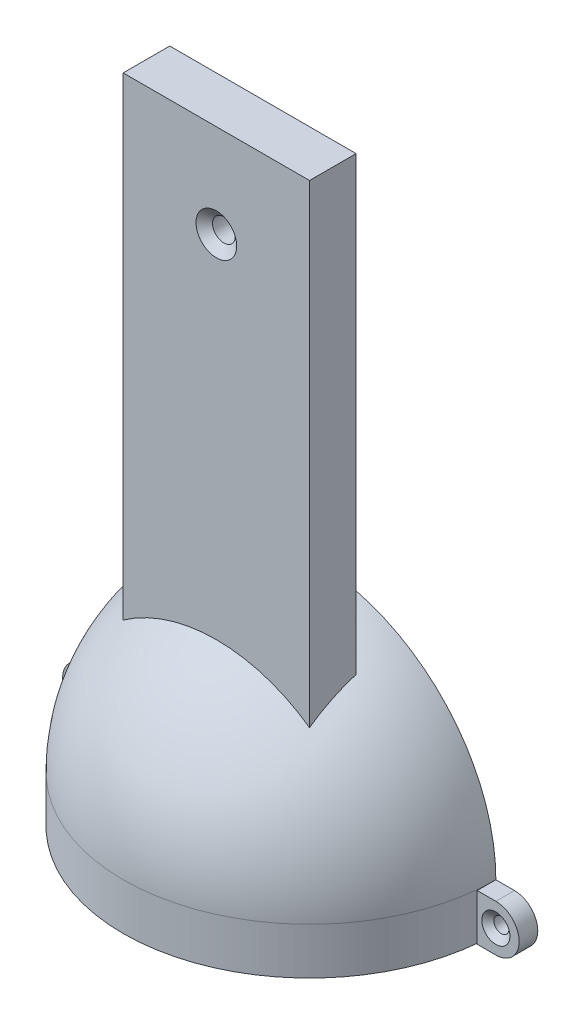
ISO-10303-21;
HEADER;
FILE_DESCRIPTION(('STEP AP214'),'2;1');
FILE_NAME('part.step','',(''),(''),'','','');
FILE_SCHEMA(('AUTOMOTIVE_DESIGN { 1 0 10303 214 1 1 1 1 }'));
ENDSEC;
DATA;
#1=APPLICATION_CONTEXT('core data for automotive mechanical design processes');
#2=APPLICATION_PROTOCOL_DEFINITION('international standard','automotive_design',2000,#1);
#3=PRODUCT_CONTEXT('',#1,'mechanical');
#4=PRODUCT('Part','Part','',(#3));
#5=PRODUCT_RELATED_PRODUCT_CATEGORY('part','',(#4));
#6=PRODUCT_DEFINITION_FORMATION('','',#4);
#7=PRODUCT_DEFINITION_CONTEXT('part definition',#1,'design');
#8=PRODUCT_DEFINITION('design','',#6,#7);
#9=PRODUCT_DEFINITION_SHAPE('','',#8);
#10=(LENGTH_UNIT() NAMED_UNIT(*) SI_UNIT(.MILLI.,.METRE.));
#11=(NAMED_UNIT(*) PLANE_ANGLE_UNIT() SI_UNIT($,.RADIAN.));
#12=(NAMED_UNIT(*) SI_UNIT($,.STERADIAN.) SOLID_ANGLE_UNIT());
#13=UNCERTAINTY_MEASURE_WITH_UNIT(LENGTH_MEASURE(1.E-05),#10,'distance_accuracy_value','');
#14=(GEOMETRIC_REPRESENTATION_CONTEXT(3) GLOBAL_UNCERTAINTY_ASSIGNED_CONTEXT((#13)) GLOBAL_UNIT_ASSIGNED_CONTEXT((#10,
#11,#12)) REPRESENTATION_CONTEXT('',''));
#15=CARTESIAN_POINT('',(0.,0.,0.));
#16=DIRECTION('',(0.,0.,1.));
#17=DIRECTION('',(1.,0.,0.));
#18=AXIS2_PLACEMENT_3D('',#15,#16,#17);
#19=CARTESIAN_POINT('',(-22.,-2.5,2.));
#20=DIRECTION('',(0.,0.,-1.));
#21=DIRECTION('',(-1.,0.,0.));
#22=AXIS2_PLACEMENT_3D('',#19,#20,#21);
#23=CYLINDRICAL_SURFACE('',#22,2.5);
#24=CARTESIAN_POINT('',(-22.,-2.5,0.));
#25=DIRECTION('',(0.,0.,-1.));
#26=DIRECTION('',(1.,0.,0.));
#27=AXIS2_PLACEMENT_3D('',#24,#25,#26);
#28=CIRCLE('',#27,2.5);
#29=CARTESIAN_POINT('',(-22.,-5.,0.));
#30=VERTEX_POINT('',#29);
#31=CARTESIAN_POINT('',(-22.,0.,0.));
#32=VERTEX_POINT('',#31);
#33=EDGE_CURVE('E116',#30,#32,#28,.T.);
#34=ORIENTED_EDGE('',*,*,#33,.F.);
#35=DIRECTION('',(0.,0.,-1.));
#36=VECTOR('',#35,1.);
#37=CARTESIAN_POINT('',(-22.,-5.,2.));
#38=LINE('',#37,#36);
#39=CARTESIAN_POINT('',(-22.,-5.,2.));
#40=VERTEX_POINT('',#39);
#41=EDGE_CURVE('E12',#40,#30,#38,.T.);
#42=ORIENTED_EDGE('',*,*,#41,.F.);
#43=CARTESIAN_POINT('',(-22.,-2.5,2.));
#44=DIRECTION('',(0.,0.,-1.));
#45=DIRECTION('',(1.,0.,0.));
#46=AXIS2_PLACEMENT_3D('',#43,#44,#45);
#47=CIRCLE('',#46,2.5);
#48=CARTESIAN_POINT('',(-22.,0.,2.));
#49=VERTEX_POINT('',#48);
#50=EDGE_CURVE('E109',#40,#49,#47,.T.);
#51=ORIENTED_EDGE('',*,*,#50,.T.);
#52=DIRECTION('',(0.,0.,-1.));
#53=VECTOR('',#52,1.);
#54=CARTESIAN_POINT('',(-22.,0.,2.));
#55=LINE('',#54,#53);
#56=EDGE_CURVE('E54',#49,#32,#55,.T.);
#57=ORIENTED_EDGE('',*,*,#56,.T.);
#58=EDGE_LOOP('',(#34,#42,#51,#57));
#59=FACE_BOUND('',#58,.T.);
#60=ADVANCED_FACE('F51',(#59),#23,.T.);
#61=CARTESIAN_POINT('',(-22.,-5.,2.));
#62=DIRECTION('',(0.,-1.,0.));
#63=DIRECTION('',(0.,0.,-1.));
#64=AXIS2_PLACEMENT_3D('',#61,#62,#63);
#65=PLANE('',#64);
#66=DIRECTION('',(-1.,0.,0.));
#67=VECTOR('',#66,1.);
#68=CARTESIAN_POINT('',(-22.,-5.,0.));
#69=LINE('',#68,#67);
#70=CARTESIAN_POINT('',(-20.,-5.,0.));
#71=VERTEX_POINT('',#70);
#72=EDGE_CURVE('E111',#71,#30,#69,.T.);
#73=ORIENTED_EDGE('',*,*,#72,.F.);
#74=DIRECTION('',(0.,0.,-1.));
#75=VECTOR('',#74,1.);
#76=CARTESIAN_POINT('',(-20.,-5.,2.));
#77=LINE('',#76,#75);
#78=CARTESIAN_POINT('',(-20.,-5.,2.));
#79=VERTEX_POINT('',#78);
#80=EDGE_CURVE('E60',#79,#71,#77,.T.);
#81=ORIENTED_EDGE('',*,*,#80,.F.);
#82=DIRECTION('',(-1.,0.,0.));
#83=VECTOR('',#82,1.);
#84=CARTESIAN_POINT('',(-22.,-5.,2.));
#85=LINE('',#84,#83);
#86=EDGE_CURVE('E106',#79,#40,#85,.T.);
#87=ORIENTED_EDGE('',*,*,#86,.T.);
#88=ORIENTED_EDGE('',*,*,#41,.T.);
#89=EDGE_LOOP('',(#73,#81,#87,#88));
#90=FACE_BOUND('',#89,.T.);
#91=ADVANCED_FACE('F127',(#90),#65,.T.);
#92=CARTESIAN_POINT('',(-20.,-5.,2.));
#93=DIRECTION('',(1.,0.,0.));
#94=DIRECTION('',(0.,1.,0.));
#95=AXIS2_PLACEMENT_3D('',#92,#93,#94);
#96=PLANE('',#95);
#97=DIRECTION('',(0.,-1.,0.));
#98=VECTOR('',#97,1.);
#99=CARTESIAN_POINT('',(-20.,-5.,0.));
#100=LINE('',#99,#98);
#101=CARTESIAN_POINT('',(-20.,0.,0.));
#102=VERTEX_POINT('',#101);
#103=EDGE_CURVE('E101',#102,#71,#100,.T.);
#104=ORIENTED_EDGE('',*,*,#103,.F.);
#105=DIRECTION('',(0.,0.,-1.));
#106=VECTOR('',#105,1.);
#107=CARTESIAN_POINT('',(-20.,0.,2.));
#108=LINE('',#107,#106);
#109=CARTESIAN_POINT('',(-20.,0.,2.));
#110=VERTEX_POINT('',#109);
#111=EDGE_CURVE('E96',#110,#102,#108,.T.);
#112=ORIENTED_EDGE('',*,*,#111,.F.);
#113=DIRECTION('',(0.,-1.,0.));
#114=VECTOR('',#113,1.);
#115=CARTESIAN_POINT('',(-20.,-5.,2.));
#116=LINE('',#115,#114);
#117=EDGE_CURVE('E99',#110,#79,#116,.T.);
#118=ORIENTED_EDGE('',*,*,#117,.T.);
#119=ORIENTED_EDGE('',*,*,#80,.T.);
#120=EDGE_LOOP('',(#104,#112,#118,#119));
#121=FACE_BOUND('',#120,.T.);
#122=ADVANCED_FACE('F98',(#121),#96,.T.);
#123=CARTESIAN_POINT('',(-22.,0.,2.));
#124=DIRECTION('',(0.,1.,0.));
#125=DIRECTION('',(0.,0.,1.));
#126=AXIS2_PLACEMENT_3D('',#123,#124,#125);
#127=PLANE('',#126);
#128=DIRECTION('',(1.,0.,0.));
#129=VECTOR('',#128,1.);
#130=CARTESIAN_POINT('',(-22.,0.,0.));
#131=LINE('',#130,#129);
#132=EDGE_CURVE('E119',#32,#102,#131,.T.);
#133=ORIENTED_EDGE('',*,*,#132,.F.);
#134=ORIENTED_EDGE('',*,*,#56,.F.);
#135=DIRECTION('',(1.,0.,0.));
#136=VECTOR('',#135,1.);
#137=CARTESIAN_POINT('',(-22.,0.,2.));
#138=LINE('',#137,#136);
#139=EDGE_CURVE('E105',#49,#110,#138,.T.);
#140=ORIENTED_EDGE('',*,*,#139,.T.);
#141=ORIENTED_EDGE('',*,*,#111,.T.);
#142=EDGE_LOOP('',(#133,#134,#140,#141));
#143=FACE_BOUND('',#142,.T.);
#144=ADVANCED_FACE('F108',(#143),#127,.T.);
#145=CARTESIAN_POINT('',(-22.,-2.5,2.));
#146=DIRECTION('',(0.,0.,1.));
#147=DIRECTION('',(1.,0.,0.));
#148=AXIS2_PLACEMENT_3D('',#145,#146,#147);
#149=PLANE('',#148);
#150=CARTESIAN_POINT('',(-22.,-2.5,2.));
#151=DIRECTION('',(0.,0.,1.));
#152=DIRECTION('',(1.,0.,0.));
#153=AXIS2_PLACEMENT_3D('',#150,#151,#152);
#154=CIRCLE('',#153,1.5113);
#155=CARTESIAN_POINT('',(-20.4887,-2.5,2.));
#156=VERTEX_POINT('',#155);
#157=EDGE_CURVE('E162',#156,#156,#154,.T.);
#158=ORIENTED_EDGE('',*,*,#157,.F.);
#159=EDGE_LOOP('',(#158));
#160=FACE_BOUND('',#159,.T.);
#161=ORIENTED_EDGE('',*,*,#50,.F.);
#162=ORIENTED_EDGE('',*,*,#86,.F.);
#163=ORIENTED_EDGE('',*,*,#117,.F.);
#164=ORIENTED_EDGE('',*,*,#139,.F.);
#165=EDGE_LOOP('',(#161,#162,#163,#164));
#166=FACE_BOUND('',#165,.T.);
#167=ADVANCED_FACE('F104',(#160,#166),#149,.T.);
#168=CARTESIAN_POINT('',(-22.,-2.5,0.));
#169=DIRECTION('',(0.,0.,1.));
#170=DIRECTION('',(1.,0.,0.));
#171=AXIS2_PLACEMENT_3D('',#168,#169,#170);
#172=PLANE('',#171);
#173=CARTESIAN_POINT('',(-22.,-2.5,0.));
#174=DIRECTION('',(0.,0.,1.));
#175=DIRECTION('',(1.,0.,0.));
#176=AXIS2_PLACEMENT_3D('',#173,#174,#175);
#177=CIRCLE('',#176,0.806449999999997);
#178=CARTESIAN_POINT('',(-21.19355,-2.5,0.));
#179=VERTEX_POINT('',#178);
#180=EDGE_CURVE('E120',#179,#179,#177,.T.);
#181=ORIENTED_EDGE('',*,*,#180,.T.);
#182=EDGE_LOOP('',(#181));
#183=FACE_BOUND('',#182,.T.);
#184=ORIENTED_EDGE('',*,*,#33,.T.);
#185=ORIENTED_EDGE('',*,*,#132,.T.);
#186=ORIENTED_EDGE('',*,*,#103,.T.);
#187=ORIENTED_EDGE('',*,*,#72,.T.);
#188=EDGE_LOOP('',(#184,#185,#186,#187));
#189=FACE_BOUND('',#188,.T.);
#190=ADVANCED_FACE('F126',(#183,#189),#172,.F.);
#191=CARTESIAN_POINT('',(-22.,-2.5,2.));
#192=DIRECTION('',(0.,0.,1.));
#193=DIRECTION('',(1.,0.,0.));
#194=AXIS2_PLACEMENT_3D('',#191,#192,#193);
#195=CYLINDRICAL_SURFACE('',#194,0.806449999999992);
#196=ORIENTED_EDGE('',*,*,#180,.F.);
#197=EDGE_LOOP('',(#196));
#198=FACE_BOUND('',#197,.T.);
#199=CARTESIAN_POINT('',(-22.,-2.5,1.40856062496469));
#200=DIRECTION('',(0.,0.,1.));
#201=DIRECTION('',(1.,0.,0.));
#202=AXIS2_PLACEMENT_3D('',#199,#200,#201);
#203=CIRCLE('',#202,0.806449999999986);
#204=CARTESIAN_POINT('',(-21.19355,-2.5,1.40856062496469));
#205=VERTEX_POINT('',#204);
#206=EDGE_CURVE('E160',#205,#205,#203,.T.);
#207=ORIENTED_EDGE('',*,*,#206,.T.);
#208=EDGE_LOOP('',(#207));
#209=FACE_BOUND('',#208,.T.);
#210=ADVANCED_FACE('F145',(#198,#209),#195,.F.);
#211=CARTESIAN_POINT('',(-22.,-2.5,2.));
#212=DIRECTION('',(0.,0.,1.));
#213=DIRECTION('',(1.,0.,0.));
#214=AXIS2_PLACEMENT_3D('',#211,#212,#213);
#215=CONICAL_SURFACE('',#214,1.5113,0.872664625997172);
#216=ORIENTED_EDGE('',*,*,#206,.F.);
#217=EDGE_LOOP('',(#216));
#218=FACE_BOUND('',#217,.T.);
#219=ORIENTED_EDGE('',*,*,#157,.T.);
#220=EDGE_LOOP('',(#219));
#221=FACE_BOUND('',#220,.T.);
#222=ADVANCED_FACE('F151',(#218,#221),#215,.F.);
#223=CLOSED_SHELL('',(#60,#91,#122,#144,#167,#190,#210,#222));
#224=MANIFOLD_SOLID_BREP('B2',#223);
#225=CARTESIAN_POINT('',(20.,0.,2.));
#226=DIRECTION('',(-1.,0.,0.));
#227=DIRECTION('',(0.,-1.,0.));
#228=AXIS2_PLACEMENT_3D('',#225,#226,#227);
#229=PLANE('',#228);
#230=DIRECTION('',(0.,1.,0.));
#231=VECTOR('',#230,1.);
#232=CARTESIAN_POINT('',(20.,0.,0.));
#233=LINE('',#232,#231);
#234=CARTESIAN_POINT('',(20.,-5.,0.));
#235=VERTEX_POINT('',#234);
#236=CARTESIAN_POINT('',(20.,0.,0.));
#237=VERTEX_POINT('',#236);
#238=EDGE_CURVE('E284',#235,#237,#233,.T.);
#239=ORIENTED_EDGE('',*,*,#238,.F.);
#240=DIRECTION('',(0.,0.,-1.));
#241=VECTOR('',#240,1.);
#242=CARTESIAN_POINT('',(20.,-5.,2.));
#243=LINE('',#242,#241);
#244=CARTESIAN_POINT('',(20.,-5.,2.));
#245=VERTEX_POINT('',#244);
#246=EDGE_CURVE('E49',#245,#235,#243,.T.);
#247=ORIENTED_EDGE('',*,*,#246,.F.);
#248=DIRECTION('',(0.,1.,0.));
#249=VECTOR('',#248,1.);
#250=CARTESIAN_POINT('',(20.,0.,2.));
#251=LINE('',#250,#249);
#252=CARTESIAN_POINT('',(20.,0.,2.));
#253=VERTEX_POINT('',#252);
#254=EDGE_CURVE('E277',#245,#253,#251,.T.);
#255=ORIENTED_EDGE('',*,*,#254,.T.);
#256=DIRECTION('',(0.,0.,-1.));
#257=VECTOR('',#256,1.);
#258=CARTESIAN_POINT('',(20.,0.,2.));
#259=LINE('',#258,#257);
#260=EDGE_CURVE('E222',#253,#237,#259,.T.);
#261=ORIENTED_EDGE('',*,*,#260,.T.);
#262=EDGE_LOOP('',(#239,#247,#255,#261));
#263=FACE_BOUND('',#262,.T.);
#264=ADVANCED_FACE('F219',(#263),#229,.T.);
#265=CARTESIAN_POINT('',(22.,-5.,2.));
#266=DIRECTION('',(0.,-1.,0.));
#267=DIRECTION('',(0.,0.,-1.));
#268=AXIS2_PLACEMENT_3D('',#265,#266,#267);
#269=PLANE('',#268);
#270=DIRECTION('',(-1.,0.,0.));
#271=VECTOR('',#270,1.);
#272=CARTESIAN_POINT('',(22.,-5.,0.));
#273=LINE('',#272,#271);
#274=CARTESIAN_POINT('',(22.,-5.,0.));
#275=VERTEX_POINT('',#274);
#276=EDGE_CURVE('E279',#275,#235,#273,.T.);
#277=ORIENTED_EDGE('',*,*,#276,.F.);
#278=DIRECTION('',(0.,0.,-1.));
#279=VECTOR('',#278,1.);
#280=CARTESIAN_POINT('',(22.,-5.,2.));
#281=LINE('',#280,#279);
#282=CARTESIAN_POINT('',(22.,-5.,2.));
#283=VERTEX_POINT('',#282);
#284=EDGE_CURVE('E228',#283,#275,#281,.T.);
#285=ORIENTED_EDGE('',*,*,#284,.F.);
#286=DIRECTION('',(-1.,0.,0.));
#287=VECTOR('',#286,1.);
#288=CARTESIAN_POINT('',(22.,-5.,2.));
#289=LINE('',#288,#287);
#290=EDGE_CURVE('E274',#283,#245,#289,.T.);
#291=ORIENTED_EDGE('',*,*,#290,.T.);
#292=ORIENTED_EDGE('',*,*,#246,.T.);
#293=EDGE_LOOP('',(#277,#285,#291,#292));
#294=FACE_BOUND('',#293,.T.);
#295=ADVANCED_FACE('F295',(#294),#269,.T.);
#296=CARTESIAN_POINT('',(22.,-2.5,2.));
#297=DIRECTION('',(0.,0.,-1.));
#298=DIRECTION('',(-1.,0.,0.));
#299=AXIS2_PLACEMENT_3D('',#296,#297,#298);
#300=CYLINDRICAL_SURFACE('',#299,2.5);
#301=CARTESIAN_POINT('',(22.,-2.5,0.));
#302=DIRECTION('',(0.,0.,-1.));
#303=DIRECTION('',(-1.,0.,0.));
#304=AXIS2_PLACEMENT_3D('',#301,#302,#303);
#305=CIRCLE('',#304,2.5);
#306=CARTESIAN_POINT('',(22.,0.,0.));
#307=VERTEX_POINT('',#306);
#308=EDGE_CURVE('E269',#307,#275,#305,.T.);
#309=ORIENTED_EDGE('',*,*,#308,.F.);
#310=DIRECTION('',(0.,0.,-1.));
#311=VECTOR('',#310,1.);
#312=CARTESIAN_POINT('',(22.,0.,2.));
#313=LINE('',#312,#311);
#314=CARTESIAN_POINT('',(22.,0.,2.));
#315=VERTEX_POINT('',#314);
#316=EDGE_CURVE('E264',#315,#307,#313,.T.);
#317=ORIENTED_EDGE('',*,*,#316,.F.);
#318=CARTESIAN_POINT('',(22.,-2.5,2.));
#319=DIRECTION('',(0.,0.,-1.));
#320=DIRECTION('',(-1.,0.,0.));
#321=AXIS2_PLACEMENT_3D('',#318,#319,#320);
#322=CIRCLE('',#321,2.5);
#323=EDGE_CURVE('E267',#315,#283,#322,.T.);
#324=ORIENTED_EDGE('',*,*,#323,.T.);
#325=ORIENTED_EDGE('',*,*,#284,.T.);
#326=EDGE_LOOP('',(#309,#317,#324,#325));
#327=FACE_BOUND('',#326,.T.);
#328=ADVANCED_FACE('F266',(#327),#300,.T.);
#329=CARTESIAN_POINT('',(22.,0.,2.));
#330=DIRECTION('',(0.,1.,0.));
#331=DIRECTION('',(0.,0.,1.));
#332=AXIS2_PLACEMENT_3D('',#329,#330,#331);
#333=PLANE('',#332);
#334=DIRECTION('',(1.,0.,0.));
#335=VECTOR('',#334,1.);
#336=CARTESIAN_POINT('',(22.,0.,0.));
#337=LINE('',#336,#335);
#338=EDGE_CURVE('E287',#237,#307,#337,.T.);
#339=ORIENTED_EDGE('',*,*,#338,.F.);
#340=ORIENTED_EDGE('',*,*,#260,.F.);
#341=DIRECTION('',(1.,0.,0.));
#342=VECTOR('',#341,1.);
#343=CARTESIAN_POINT('',(22.,0.,2.));
#344=LINE('',#343,#342);
#345=EDGE_CURVE('E273',#253,#315,#344,.T.);
#346=ORIENTED_EDGE('',*,*,#345,.T.);
#347=ORIENTED_EDGE('',*,*,#316,.T.);
#348=EDGE_LOOP('',(#339,#340,#346,#347));
#349=FACE_BOUND('',#348,.T.);
#350=ADVANCED_FACE('F276',(#349),#333,.T.);
#351=CARTESIAN_POINT('',(22.,-2.5,2.));
#352=DIRECTION('',(0.,0.,-1.));
#353=DIRECTION('',(-1.,0.,0.));
#354=AXIS2_PLACEMENT_3D('',#351,#352,#353);
#355=PLANE('',#354);
#356=CARTESIAN_POINT('',(22.,-2.5,2.));
#357=DIRECTION('',(0.,0.,1.));
#358=DIRECTION('',(1.,0.,0.));
#359=AXIS2_PLACEMENT_3D('',#356,#357,#358);
#360=CIRCLE('',#359,1.5113);
#361=CARTESIAN_POINT('',(23.5113,-2.5,2.));
#362=VERTEX_POINT('',#361);
#363=EDGE_CURVE('E330',#362,#362,#360,.T.);
#364=ORIENTED_EDGE('',*,*,#363,.F.);
#365=EDGE_LOOP('',(#364));
#366=FACE_BOUND('',#365,.T.);
#367=ORIENTED_EDGE('',*,*,#254,.F.);
#368=ORIENTED_EDGE('',*,*,#290,.F.);
#369=ORIENTED_EDGE('',*,*,#323,.F.);
#370=ORIENTED_EDGE('',*,*,#345,.F.);
#371=EDGE_LOOP('',(#367,#368,#369,#370));
#372=FACE_BOUND('',#371,.T.);
#373=ADVANCED_FACE('F272',(#366,#372),#355,.F.);
#374=CARTESIAN_POINT('',(22.,-2.5,0.));
#375=DIRECTION('',(0.,0.,-1.));
#376=DIRECTION('',(-1.,0.,0.));
#377=AXIS2_PLACEMENT_3D('',#374,#375,#376);
#378=PLANE('',#377);
#379=CARTESIAN_POINT('',(22.,-2.5,0.));
#380=DIRECTION('',(0.,0.,1.));
#381=DIRECTION('',(1.,0.,0.));
#382=AXIS2_PLACEMENT_3D('',#379,#380,#381);
#383=CIRCLE('',#382,0.806449999999997);
#384=CARTESIAN_POINT('',(22.80645,-2.5,0.));
#385=VERTEX_POINT('',#384);
#386=EDGE_CURVE('E288',#385,#385,#383,.T.);
#387=ORIENTED_EDGE('',*,*,#386,.T.);
#388=EDGE_LOOP('',(#387));
#389=FACE_BOUND('',#388,.T.);
#390=ORIENTED_EDGE('',*,*,#238,.T.);
#391=ORIENTED_EDGE('',*,*,#338,.T.);
#392=ORIENTED_EDGE('',*,*,#308,.T.);
#393=ORIENTED_EDGE('',*,*,#276,.T.);
#394=EDGE_LOOP('',(#390,#391,#392,#393));
#395=FACE_BOUND('',#394,.T.);
#396=ADVANCED_FACE('F294',(#389,#395),#378,.T.);
#397=CARTESIAN_POINT('',(22.,-2.5,2.));
#398=DIRECTION('',(0.,0.,1.));
#399=DIRECTION('',(1.,0.,0.));
#400=AXIS2_PLACEMENT_3D('',#397,#398,#399);
#401=CYLINDRICAL_SURFACE('',#400,0.806449999999992);
#402=ORIENTED_EDGE('',*,*,#386,.F.);
#403=EDGE_LOOP('',(#402));
#404=FACE_BOUND('',#403,.T.);
#405=CARTESIAN_POINT('',(22.,-2.5,1.40856062496469));
#406=DIRECTION('',(0.,0.,1.));
#407=DIRECTION('',(1.,0.,0.));
#408=AXIS2_PLACEMENT_3D('',#405,#406,#407);
#409=CIRCLE('',#408,0.806449999999986);
#410=CARTESIAN_POINT('',(22.80645,-2.5,1.40856062496469));
#411=VERTEX_POINT('',#410);
#412=EDGE_CURVE('E328',#411,#411,#409,.T.);
#413=ORIENTED_EDGE('',*,*,#412,.T.);
#414=EDGE_LOOP('',(#413));
#415=FACE_BOUND('',#414,.T.);
#416=ADVANCED_FACE('F313',(#404,#415),#401,.F.);
#417=CARTESIAN_POINT('',(22.,-2.5,2.));
#418=DIRECTION('',(0.,0.,1.));
#419=DIRECTION('',(1.,0.,0.));
#420=AXIS2_PLACEMENT_3D('',#417,#418,#419);
#421=CONICAL_SURFACE('',#420,1.5113,0.872664625997172);
#422=ORIENTED_EDGE('',*,*,#412,.F.);
#423=EDGE_LOOP('',(#422));
#424=FACE_BOUND('',#423,.T.);
#425=ORIENTED_EDGE('',*,*,#363,.T.);
#426=EDGE_LOOP('',(#425));
#427=FACE_BOUND('',#426,.T.);
#428=ADVANCED_FACE('F319',(#424,#427),#421,.F.);
#429=CLOSED_SHELL('',(#264,#295,#328,#350,#373,#396,#416,#428));
#430=MANIFOLD_SOLID_BREP('B6',#429);
#431=CARTESIAN_POINT('',(0.,55.,0.));
#432=DIRECTION('',(0.,0.,-1.));
#433=DIRECTION('',(-1.,0.,0.));
#434=AXIS2_PLACEMENT_3D('',#431,#432,#433);
#435=PLANE('',#434);
#436=CARTESIAN_POINT('',(0.,55.,0.));
#437=DIRECTION('',(0.,0.,-1.));
#438=DIRECTION('',(-1.,0.,0.));
#439=AXIS2_PLACEMENT_3D('',#436,#437,#438);
#440=CIRCLE('',#439,5.);
#441=CARTESIAN_POINT('',(-5.,55.,0.));
#442=VERTEX_POINT('',#441);
#443=EDGE_CURVE('E526',#442,#442,#440,.T.);
#444=ORIENTED_EDGE('',*,*,#443,.T.);
#445=EDGE_LOOP('',(#444));
#446=FACE_BOUND('',#445,.T.);
#447=CARTESIAN_POINT('',(0.,55.,0.));
#448=DIRECTION('',(0.,0.,1.));
#449=DIRECTION('',(1.,0.,0.));
#450=AXIS2_PLACEMENT_3D('',#447,#448,#449);
#451=CIRCLE('',#450,1.2192);
#452=CARTESIAN_POINT('',(1.2192,55.,0.));
#453=VERTEX_POINT('',#452);
#454=EDGE_CURVE('E529',#453,#453,#451,.T.);
#455=ORIENTED_EDGE('',*,*,#454,.T.);
#456=EDGE_LOOP('',(#455));
#457=FACE_BOUND('',#456,.T.);
#458=ADVANCED_FACE('F378',(#446,#457),#435,.T.);
#459=CARTESIAN_POINT('',(0.,0.,0.));
#460=DIRECTION('',(-1.,0.,0.));
#461=DIRECTION('',(0.,0.,1.));
#462=AXIS2_PLACEMENT_3D('',#459,#460,#461);
#463=SPHERICAL_SURFACE('',#462,20.);
#464=CARTESIAN_POINT('',(0.,0.,0.));
#465=DIRECTION('',(0.,0.,1.));
#466=DIRECTION('',(1.,0.,0.));
#467=AXIS2_PLACEMENT_3D('',#464,#465,#466);
#468=CIRCLE('',#467,20.);
#469=CARTESIAN_POINT('',(20.,0.,0.));
#470=VERTEX_POINT('',#469);
#471=CARTESIAN_POINT('',(-20.,0.,0.));
#472=VERTEX_POINT('',#471);
#473=EDGE_CURVE('E507',#470,#472,#468,.T.);
#474=ORIENTED_EDGE('',*,*,#473,.T.);
#475=CARTESIAN_POINT('',(0.,0.,0.));
#476=DIRECTION('',(0.,-1.,0.));
#477=DIRECTION('',(1.,0.,0.));
#478=AXIS2_PLACEMENT_3D('',#475,#476,#477);
#479=CIRCLE('',#478,20.);
#480=EDGE_CURVE('E459',#470,#472,#479,.T.);
#481=ORIENTED_EDGE('',*,*,#480,.F.);
#482=EDGE_LOOP('',(#474,#481));
#483=FACE_BOUND('',#482,.T.);
#484=CARTESIAN_POINT('',(9.99999999999999,0.,0.));
#485=DIRECTION('',(-1.,0.,0.));
#486=DIRECTION('',(0.,0.,1.));
#487=AXIS2_PLACEMENT_3D('',#484,#485,#486);
#488=CIRCLE('',#487,17.3205080756888);
#489=CARTESIAN_POINT('',(10.,14.142135623731,10.));
#490=VERTEX_POINT('',#489);
#491=CARTESIAN_POINT('',(10.,16.583123951777,5.));
#492=VERTEX_POINT('',#491);
#493=EDGE_CURVE('E386',#490,#492,#488,.T.);
#494=ORIENTED_EDGE('',*,*,#493,.F.);
#495=CARTESIAN_POINT('',(0.,0.,10.));
#496=DIRECTION('',(0.,0.,-1.));
#497=DIRECTION('',(-1.,0.,0.));
#498=AXIS2_PLACEMENT_3D('',#495,#496,#497);
#499=CIRCLE('',#498,17.3205080756888);
#500=CARTESIAN_POINT('',(-10.,14.1421356237309,10.));
#501=VERTEX_POINT('',#500);
#502=EDGE_CURVE('E445',#501,#490,#499,.T.);
#503=ORIENTED_EDGE('',*,*,#502,.F.);
#504=CARTESIAN_POINT('',(-10.,0.,0.));
#505=DIRECTION('',(1.,0.,0.));
#506=DIRECTION('',(0.,0.,-1.));
#507=AXIS2_PLACEMENT_3D('',#504,#505,#506);
#508=CIRCLE('',#507,17.3205080756888);
#509=CARTESIAN_POINT('',(-10.,16.583123951777,5.));
#510=VERTEX_POINT('',#509);
#511=EDGE_CURVE('E398',#510,#501,#508,.T.);
#512=ORIENTED_EDGE('',*,*,#511,.F.);
#513=CARTESIAN_POINT('',(0.,0.,5.));
#514=DIRECTION('',(0.,0.,1.));
#515=DIRECTION('',(1.,0.,0.));
#516=AXIS2_PLACEMENT_3D('',#513,#514,#515);
#517=CIRCLE('',#516,19.3649167310371);
#518=EDGE_CURVE('E393',#492,#510,#517,.T.);
#519=ORIENTED_EDGE('',*,*,#518,.F.);
#520=EDGE_LOOP('',(#494,#503,#512,#519));
#521=FACE_BOUND('',#520,.T.);
#522=ADVANCED_FACE('F380',(#483,#521),#463,.T.);
#523=CARTESIAN_POINT('',(0.,0.,0.));
#524=DIRECTION('',(-1.,0.,0.));
#525=DIRECTION('',(0.,0.,1.));
#526=AXIS2_PLACEMENT_3D('',#523,#524,#525);
#527=SPHERICAL_SURFACE('',#526,15.);
#528=CARTESIAN_POINT('',(0.,0.,0.));
#529=DIRECTION('',(0.,0.,1.));
#530=DIRECTION('',(1.,0.,0.));
#531=AXIS2_PLACEMENT_3D('',#528,#529,#530);
#532=CIRCLE('',#531,15.);
#533=CARTESIAN_POINT('',(15.,0.,0.));
#534=VERTEX_POINT('',#533);
#535=CARTESIAN_POINT('',(-15.,0.,0.));
#536=VERTEX_POINT('',#535);
#537=EDGE_CURVE('E504',#534,#536,#532,.T.);
#538=ORIENTED_EDGE('',*,*,#537,.F.);
#539=CARTESIAN_POINT('',(0.,0.,0.));
#540=DIRECTION('',(0.,-1.,0.));
#541=DIRECTION('',(1.,0.,0.));
#542=AXIS2_PLACEMENT_3D('',#539,#540,#541);
#543=CIRCLE('',#542,15.);
#544=EDGE_CURVE('E510',#534,#536,#543,.T.);
#545=ORIENTED_EDGE('',*,*,#544,.T.);
#546=EDGE_LOOP('',(#538,#545));
#547=FACE_BOUND('',#546,.T.);
#548=ADVANCED_FACE('F557',(#547),#527,.F.);
#549=CARTESIAN_POINT('',(0.,0.,0.));
#550=DIRECTION('',(0.,0.,1.));
#551=DIRECTION('',(1.,0.,0.));
#552=AXIS2_PLACEMENT_3D('',#549,#550,#551);
#553=PLANE('',#552);
#554=ORIENTED_EDGE('',*,*,#537,.T.);
#555=DIRECTION('',(1.,0.,0.));
#556=VECTOR('',#555,1.);
#557=CARTESIAN_POINT('',(-20.,0.,0.));
#558=LINE('',#557,#556);
#559=CARTESIAN_POINT('',(-10.,0.,0.));
#560=VERTEX_POINT('',#559);
#561=EDGE_CURVE('E481',#536,#560,#558,.T.);
#562=ORIENTED_EDGE('',*,*,#561,.T.);
#563=DIRECTION('',(0.,1.,0.));
#564=VECTOR('',#563,1.);
#565=CARTESIAN_POINT('',(-10.,-5.,0.));
#566=LINE('',#565,#564);
#567=CARTESIAN_POINT('',(-10.,-5.,0.));
#568=VERTEX_POINT('',#567);
#569=EDGE_CURVE('E487',#568,#560,#566,.T.);
#570=ORIENTED_EDGE('',*,*,#569,.F.);
#571=DIRECTION('',(1.,0.,0.));
#572=VECTOR('',#571,1.);
#573=CARTESIAN_POINT('',(-20.,-5.,0.));
#574=LINE('',#573,#572);
#575=CARTESIAN_POINT('',(-20.,-5.,0.));
#576=VERTEX_POINT('',#575);
#577=EDGE_CURVE('E485',#576,#568,#574,.T.);
#578=ORIENTED_EDGE('',*,*,#577,.F.);
#579=DIRECTION('',(0.,1.,0.));
#580=VECTOR('',#579,1.);
#581=CARTESIAN_POINT('',(-20.,-5.,0.));
#582=LINE('',#581,#580);
#583=EDGE_CURVE('E496',#576,#472,#582,.T.);
#584=ORIENTED_EDGE('',*,*,#583,.T.);
#585=ORIENTED_EDGE('',*,*,#473,.F.);
#586=DIRECTION('',(0.,1.,0.));
#587=VECTOR('',#586,1.);
#588=CARTESIAN_POINT('',(20.,-5.,0.));
#589=LINE('',#588,#587);
#590=CARTESIAN_POINT('',(20.,-5.,0.));
#591=VERTEX_POINT('',#590);
#592=EDGE_CURVE('E499',#591,#470,#589,.T.);
#593=ORIENTED_EDGE('',*,*,#592,.F.);
#594=DIRECTION('',(1.,0.,0.));
#595=VECTOR('',#594,1.);
#596=CARTESIAN_POINT('',(10.,-5.,0.));
#597=LINE('',#596,#595);
#598=CARTESIAN_POINT('',(10.,-5.,0.));
#599=VERTEX_POINT('',#598);
#600=EDGE_CURVE('E480',#599,#591,#597,.T.);
#601=ORIENTED_EDGE('',*,*,#600,.F.);
#602=DIRECTION('',(0.,1.,0.));
#603=VECTOR('',#602,1.);
#604=CARTESIAN_POINT('',(10.,-5.,0.));
#605=LINE('',#604,#603);
#606=CARTESIAN_POINT('',(10.,0.,0.));
#607=VERTEX_POINT('',#606);
#608=EDGE_CURVE('E501',#599,#607,#605,.T.);
#609=ORIENTED_EDGE('',*,*,#608,.T.);
#610=DIRECTION('',(1.,0.,0.));
#611=VECTOR('',#610,1.);
#612=CARTESIAN_POINT('',(10.,0.,0.));
#613=LINE('',#612,#611);
#614=EDGE_CURVE('E490',#607,#534,#613,.T.);
#615=ORIENTED_EDGE('',*,*,#614,.T.);
#616=EDGE_LOOP('',(#554,#562,#570,#578,#584,#585,#593,#601,#609,#615));
#617=FACE_BOUND('',#616,.T.);
#618=ADVANCED_FACE('F586',(#617),#553,.F.);
#619=CARTESIAN_POINT('',(0.,0.,0.));
#620=DIRECTION('',(0.,-1.,0.));
#621=DIRECTION('',(0.,0.,-1.));
#622=AXIS2_PLACEMENT_3D('',#619,#620,#621);
#623=PLANE('',#622);
#624=ORIENTED_EDGE('',*,*,#544,.F.);
#625=ORIENTED_EDGE('',*,*,#614,.F.);
#626=CARTESIAN_POINT('',(0.,0.,0.));
#627=DIRECTION('',(0.,1.,0.));
#628=DIRECTION('',(0.,0.,-1.));
#629=AXIS2_PLACEMENT_3D('',#626,#627,#628);
#630=CIRCLE('',#629,10.);
#631=EDGE_CURVE('E476',#560,#607,#630,.T.);
#632=ORIENTED_EDGE('',*,*,#631,.F.);
#633=ORIENTED_EDGE('',*,*,#561,.F.);
#634=EDGE_LOOP('',(#624,#625,#632,#633));
#635=FACE_BOUND('',#634,.T.);
#636=ADVANCED_FACE('F582',(#635),#623,.F.);
#637=CARTESIAN_POINT('',(0.,-5.,0.));
#638=DIRECTION('',(0.,1.,0.));
#639=DIRECTION('',(0.,0.,1.));
#640=AXIS2_PLACEMENT_3D('',#637,#638,#639);
#641=CYLINDRICAL_SURFACE('',#640,10.);
#642=ORIENTED_EDGE('',*,*,#631,.T.);
#643=ORIENTED_EDGE('',*,*,#608,.F.);
#644=CARTESIAN_POINT('',(0.,-5.,0.));
#645=DIRECTION('',(0.,1.,0.));
#646=DIRECTION('',(0.,0.,-1.));
#647=AXIS2_PLACEMENT_3D('',#644,#645,#646);
#648=CIRCLE('',#647,10.);
#649=EDGE_CURVE('E477',#568,#599,#648,.T.);
#650=ORIENTED_EDGE('',*,*,#649,.F.);
#651=ORIENTED_EDGE('',*,*,#569,.T.);
#652=EDGE_LOOP('',(#642,#643,#650,#651));
#653=FACE_BOUND('',#652,.T.);
#654=ADVANCED_FACE('F585',(#653),#641,.F.);
#655=CARTESIAN_POINT('',(0.,-5.,0.));
#656=DIRECTION('',(0.,1.,0.));
#657=DIRECTION('',(0.,0.,1.));
#658=AXIS2_PLACEMENT_3D('',#655,#656,#657);
#659=CYLINDRICAL_SURFACE('',#658,20.);
#660=ORIENTED_EDGE('',*,*,#480,.T.);
#661=ORIENTED_EDGE('',*,*,#583,.F.);
#662=CARTESIAN_POINT('',(0.,-5.,0.));
#663=DIRECTION('',(0.,-1.,0.));
#664=DIRECTION('',(0.,0.,-1.));
#665=AXIS2_PLACEMENT_3D('',#662,#663,#664);
#666=CIRCLE('',#665,20.);
#667=EDGE_CURVE('E483',#591,#576,#666,.T.);
#668=ORIENTED_EDGE('',*,*,#667,.F.);
#669=ORIENTED_EDGE('',*,*,#592,.T.);
#670=EDGE_LOOP('',(#660,#661,#668,#669));
#671=FACE_BOUND('',#670,.T.);
#672=ADVANCED_FACE('F580',(#671),#659,.T.);
#673=CARTESIAN_POINT('',(0.,-5.,0.));
#674=DIRECTION('',(0.,-1.,0.));
#675=DIRECTION('',(0.,0.,-1.));
#676=AXIS2_PLACEMENT_3D('',#673,#674,#675);
#677=PLANE('',#676);
#678=ORIENTED_EDGE('',*,*,#649,.T.);
#679=ORIENTED_EDGE('',*,*,#600,.T.);
#680=ORIENTED_EDGE('',*,*,#667,.T.);
#681=ORIENTED_EDGE('',*,*,#577,.T.);
#682=EDGE_LOOP('',(#678,#679,#680,#681));
#683=FACE_BOUND('',#682,.T.);
#684=ADVANCED_FACE('F548',(#683),#677,.T.);
#685=CARTESIAN_POINT('',(-10.,65.,5.));
#686=DIRECTION('',(1.,0.,0.));
#687=DIRECTION('',(0.,0.,-1.));
#688=AXIS2_PLACEMENT_3D('',#685,#686,#687);
#689=PLANE('',#688);
#690=DIRECTION('',(0.,-1.,0.));
#691=VECTOR('',#690,1.);
#692=CARTESIAN_POINT('',(-10.,65.,5.));
#693=LINE('',#692,#691);
#694=CARTESIAN_POINT('',(-10.,65.,5.));
#695=VERTEX_POINT('',#694);
#696=EDGE_CURVE('E466',#695,#510,#693,.T.);
#697=ORIENTED_EDGE('',*,*,#696,.T.);
#698=ORIENTED_EDGE('',*,*,#511,.T.);
#699=DIRECTION('',(0.,-1.,0.));
#700=VECTOR('',#699,1.);
#701=CARTESIAN_POINT('',(-10.,65.,10.));
#702=LINE('',#701,#700);
#703=CARTESIAN_POINT('',(-10.,65.,10.));
#704=VERTEX_POINT('',#703);
#705=EDGE_CURVE('E458',#704,#501,#702,.T.);
#706=ORIENTED_EDGE('',*,*,#705,.F.);
#707=DIRECTION('',(0.,0.,1.));
#708=VECTOR('',#707,1.);
#709=CARTESIAN_POINT('',(-10.,65.,5.));
#710=LINE('',#709,#708);
#711=EDGE_CURVE('E468',#695,#704,#710,.T.);
#712=ORIENTED_EDGE('',*,*,#711,.F.);
#713=EDGE_LOOP('',(#697,#698,#706,#712));
#714=FACE_BOUND('',#713,.T.);
#715=ADVANCED_FACE('F520',(#714),#689,.F.);
#716=CARTESIAN_POINT('',(10.,65.,10.));
#717=DIRECTION('',(0.,0.,-1.));
#718=DIRECTION('',(-1.,0.,0.));
#719=AXIS2_PLACEMENT_3D('',#716,#717,#718);
#720=PLANE('',#719);
#721=CARTESIAN_POINT('',(0.,55.,10.));
#722=DIRECTION('',(0.,0.,1.));
#723=DIRECTION('',(1.,0.,0.));
#724=AXIS2_PLACEMENT_3D('',#721,#722,#723);
#725=CIRCLE('',#724,2.1844);
#726=CARTESIAN_POINT('',(2.1844,55.,10.));
#727=VERTEX_POINT('',#726);
#728=EDGE_CURVE('E535',#727,#727,#725,.T.);
#729=ORIENTED_EDGE('',*,*,#728,.F.);
#730=EDGE_LOOP('',(#729));
#731=FACE_BOUND('',#730,.T.);
#732=ORIENTED_EDGE('',*,*,#705,.T.);
#733=ORIENTED_EDGE('',*,*,#502,.T.);
#734=DIRECTION('',(0.,-1.,0.));
#735=VECTOR('',#734,1.);
#736=CARTESIAN_POINT('',(10.,65.,10.));
#737=LINE('',#736,#735);
#738=CARTESIAN_POINT('',(10.,65.,10.));
#739=VERTEX_POINT('',#738);
#740=EDGE_CURVE('E455',#739,#490,#737,.T.);
#741=ORIENTED_EDGE('',*,*,#740,.F.);
#742=DIRECTION('',(1.,0.,0.));
#743=VECTOR('',#742,1.);
#744=CARTESIAN_POINT('',(10.,65.,10.));
#745=LINE('',#744,#743);
#746=EDGE_CURVE('E464',#704,#739,#745,.T.);
#747=ORIENTED_EDGE('',*,*,#746,.F.);
#748=EDGE_LOOP('',(#732,#733,#741,#747));
#749=FACE_BOUND('',#748,.T.);
#750=ADVANCED_FACE('F453',(#731,#749),#720,.F.);
#751=CARTESIAN_POINT('',(10.,65.,5.));
#752=DIRECTION('',(-1.,0.,0.));
#753=DIRECTION('',(0.,0.,1.));
#754=AXIS2_PLACEMENT_3D('',#751,#752,#753);
#755=PLANE('',#754);
#756=ORIENTED_EDGE('',*,*,#740,.T.);
#757=ORIENTED_EDGE('',*,*,#493,.T.);
#758=DIRECTION('',(0.,-1.,0.));
#759=VECTOR('',#758,1.);
#760=CARTESIAN_POINT('',(10.,65.,5.));
#761=LINE('',#760,#759);
#762=CARTESIAN_POINT('',(10.,65.,5.));
#763=VERTEX_POINT('',#762);
#764=EDGE_CURVE('E474',#763,#492,#761,.T.);
#765=ORIENTED_EDGE('',*,*,#764,.F.);
#766=DIRECTION('',(0.,0.,-1.));
#767=VECTOR('',#766,1.);
#768=CARTESIAN_POINT('',(10.,65.,5.));
#769=LINE('',#768,#767);
#770=EDGE_CURVE('E463',#739,#763,#769,.T.);
#771=ORIENTED_EDGE('',*,*,#770,.F.);
#772=EDGE_LOOP('',(#756,#757,#765,#771));
#773=FACE_BOUND('',#772,.T.);
#774=ADVANCED_FACE('F461',(#773),#755,.F.);
#775=CARTESIAN_POINT('',(10.,65.,5.));
#776=DIRECTION('',(0.,0.,1.));
#777=DIRECTION('',(1.,0.,0.));
#778=AXIS2_PLACEMENT_3D('',#775,#776,#777);
#779=PLANE('',#778);
#780=CARTESIAN_POINT('',(0.,55.,5.));
#781=DIRECTION('',(0.,0.,1.));
#782=DIRECTION('',(1.,0.,0.));
#783=AXIS2_PLACEMENT_3D('',#780,#781,#782);
#784=CIRCLE('',#783,5.);
#785=CARTESIAN_POINT('',(5.,55.,5.));
#786=VERTEX_POINT('',#785);
#787=EDGE_CURVE('E217',#786,#786,#784,.F.);
#788=ORIENTED_EDGE('',*,*,#787,.F.);
#789=EDGE_LOOP('',(#788));
#790=FACE_BOUND('',#789,.T.);
#791=ORIENTED_EDGE('',*,*,#764,.T.);
#792=ORIENTED_EDGE('',*,*,#518,.T.);
#793=ORIENTED_EDGE('',*,*,#696,.F.);
#794=DIRECTION('',(-1.,0.,0.));
#795=VECTOR('',#794,1.);
#796=CARTESIAN_POINT('',(10.,65.,5.));
#797=LINE('',#796,#795);
#798=EDGE_CURVE('E522',#763,#695,#797,.T.);
#799=ORIENTED_EDGE('',*,*,#798,.F.);
#800=EDGE_LOOP('',(#791,#792,#793,#799));
#801=FACE_BOUND('',#800,.T.);
#802=ADVANCED_FACE('F517',(#790,#801),#779,.F.);
#803=CARTESIAN_POINT('',(0.,65.,0.));
#804=DIRECTION('',(0.,-1.,0.));
#805=DIRECTION('',(0.,0.,-1.));
#806=AXIS2_PLACEMENT_3D('',#803,#804,#805);
#807=PLANE('',#806);
#808=ORIENTED_EDGE('',*,*,#770,.T.);
#809=ORIENTED_EDGE('',*,*,#798,.T.);
#810=ORIENTED_EDGE('',*,*,#711,.T.);
#811=ORIENTED_EDGE('',*,*,#746,.T.);
#812=EDGE_LOOP('',(#808,#809,#810,#811));
#813=FACE_BOUND('',#812,.T.);
#814=ADVANCED_FACE('F566',(#813),#807,.F.);
#815=CARTESIAN_POINT('',(0.,55.,0.));
#816=DIRECTION('',(0.,0.,1.));
#817=DIRECTION('',(1.,0.,0.));
#818=AXIS2_PLACEMENT_3D('',#815,#816,#817);
#819=CYLINDRICAL_SURFACE('',#818,5.);
#820=ORIENTED_EDGE('',*,*,#443,.F.);
#821=EDGE_LOOP('',(#820));
#822=FACE_BOUND('',#821,.T.);
#823=ORIENTED_EDGE('',*,*,#787,.T.);
#824=EDGE_LOOP('',(#823));
#825=FACE_BOUND('',#824,.T.);
#826=ADVANCED_FACE('F564',(#822,#825),#819,.T.);
#827=CARTESIAN_POINT('',(0.,55.,10.));
#828=DIRECTION('',(0.,0.,1.));
#829=DIRECTION('',(1.,0.,0.));
#830=AXIS2_PLACEMENT_3D('',#827,#828,#829);
#831=CYLINDRICAL_SURFACE('',#830,1.2192);
#832=ORIENTED_EDGE('',*,*,#454,.F.);
#833=EDGE_LOOP('',(#832));
#834=FACE_BOUND('',#833,.T.);
#835=CARTESIAN_POINT('',(0.,55.,9.19010103598769));
#836=DIRECTION('',(0.,0.,1.));
#837=DIRECTION('',(1.,0.,0.));
#838=AXIS2_PLACEMENT_3D('',#835,#836,#837);
#839=CIRCLE('',#838,1.2192);
#840=CARTESIAN_POINT('',(1.2192,55.,9.19010103598769));
#841=VERTEX_POINT('',#840);
#842=EDGE_CURVE('E532',#841,#841,#839,.T.);
#843=ORIENTED_EDGE('',*,*,#842,.T.);
#844=EDGE_LOOP('',(#843));
#845=FACE_BOUND('',#844,.T.);
#846=ADVANCED_FACE('F562',(#834,#845),#831,.F.);
#847=CARTESIAN_POINT('',(0.,55.,10.));
#848=DIRECTION('',(0.,0.,1.));
#849=DIRECTION('',(1.,0.,0.));
#850=AXIS2_PLACEMENT_3D('',#847,#848,#849);
#851=CONICAL_SURFACE('',#850,2.1844,0.872664625997165);
#852=ORIENTED_EDGE('',*,*,#842,.F.);
#853=EDGE_LOOP('',(#852));
#854=FACE_BOUND('',#853,.T.);
#855=ORIENTED_EDGE('',*,*,#728,.T.);
#856=EDGE_LOOP('',(#855));
#857=FACE_BOUND('',#856,.T.);
#858=ADVANCED_FACE('F539',(#854,#857),#851,.F.);
#859=CLOSED_SHELL('',(#458,#522,#548,#618,#636,#654,#672,#684,#715,#750,#774,#802,#814,#826,
#846,#858));
#860=MANIFOLD_SOLID_BREP('B43',#859);
#861=ADVANCED_BREP_SHAPE_REPRESENTATION('',(#18,#224,#430,#860),#14);
#862=SHAPE_DEFINITION_REPRESENTATION(#9,#861);
ENDSEC;
END-ISO-10303-21;
